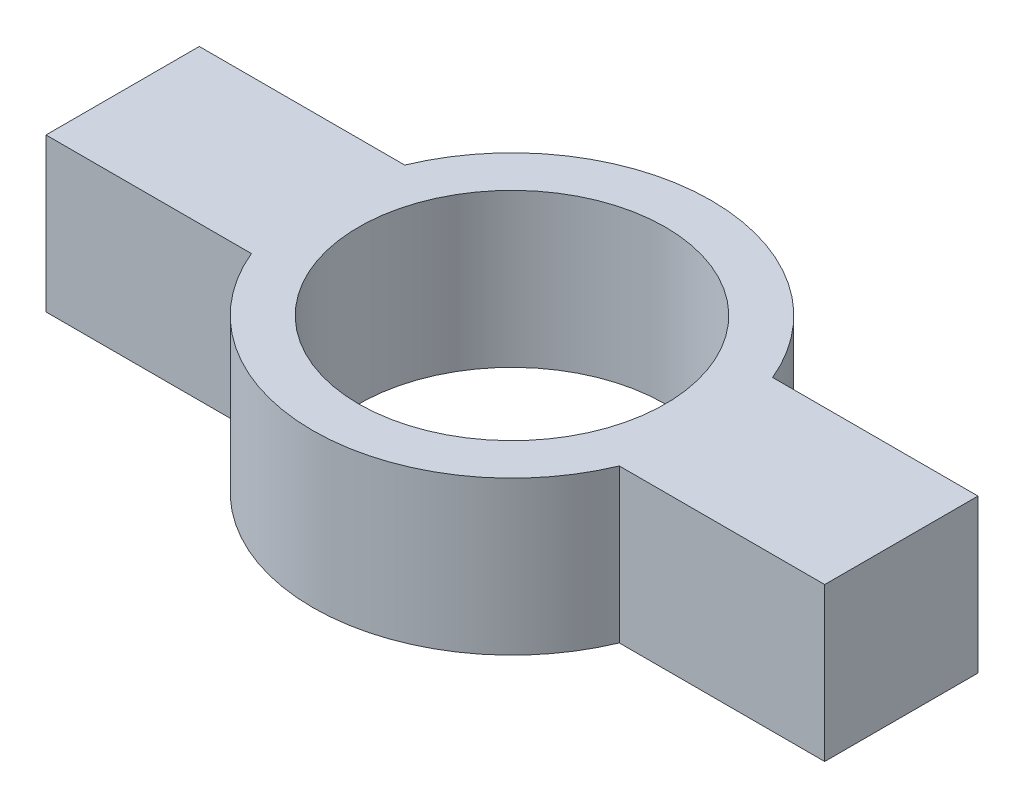
ISO-10303-21;
HEADER;
FILE_DESCRIPTION(('STEP AP214'),'2;1');
FILE_NAME('part.step','',(''),(''),'','','');
FILE_SCHEMA(('AUTOMOTIVE_DESIGN { 1 0 10303 214 1 1 1 1 }'));
ENDSEC;
DATA;
#1=APPLICATION_CONTEXT('core data for automotive mechanical design processes');
#2=APPLICATION_PROTOCOL_DEFINITION('international standard','automotive_design',2000,#1);
#3=PRODUCT_CONTEXT('',#1,'mechanical');
#4=PRODUCT('Part','Part','',(#3));
#5=PRODUCT_RELATED_PRODUCT_CATEGORY('part','',(#4));
#6=PRODUCT_DEFINITION_FORMATION('','',#4);
#7=PRODUCT_DEFINITION_CONTEXT('part definition',#1,'design');
#8=PRODUCT_DEFINITION('design','',#6,#7);
#9=PRODUCT_DEFINITION_SHAPE('','',#8);
#10=(LENGTH_UNIT() NAMED_UNIT(*) SI_UNIT(.MILLI.,.METRE.));
#11=(NAMED_UNIT(*) PLANE_ANGLE_UNIT() SI_UNIT($,.RADIAN.));
#12=(NAMED_UNIT(*) SI_UNIT($,.STERADIAN.) SOLID_ANGLE_UNIT());
#13=UNCERTAINTY_MEASURE_WITH_UNIT(LENGTH_MEASURE(1.E-05),#10,'distance_accuracy_value','');
#14=(GEOMETRIC_REPRESENTATION_CONTEXT(3) GLOBAL_UNCERTAINTY_ASSIGNED_CONTEXT((#13)) GLOBAL_UNIT_ASSIGNED_CONTEXT((#10,
#11,#12)) REPRESENTATION_CONTEXT('',''));
#15=CARTESIAN_POINT('',(0.,0.,0.));
#16=DIRECTION('',(0.,0.,1.));
#17=DIRECTION('',(1.,0.,0.));
#18=AXIS2_PLACEMENT_3D('',#15,#16,#17);
#19=CARTESIAN_POINT('',(0.,5.,0.));
#20=DIRECTION('',(0.,-1.,0.));
#21=DIRECTION('',(0.,0.,-1.));
#22=AXIS2_PLACEMENT_3D('',#19,#20,#21);
#23=CYLINDRICAL_SURFACE('',#22,6.5);
#24=DIRECTION('',(0.,-1.,0.));
#25=VECTOR('',#24,1.);
#26=CARTESIAN_POINT('',(-6.,5.,-2.5));
#27=LINE('',#26,#25);
#28=CARTESIAN_POINT('',(-6.,5.,-2.5));
#29=VERTEX_POINT('',#28);
#30=CARTESIAN_POINT('',(-6.,0.,-2.5));
#31=VERTEX_POINT('',#30);
#32=EDGE_CURVE('E135',#29,#31,#27,.T.);
#33=ORIENTED_EDGE('',*,*,#32,.F.);
#34=CARTESIAN_POINT('',(0.,5.,0.));
#35=DIRECTION('',(0.,1.,0.));
#36=DIRECTION('',(0.,0.,1.));
#37=AXIS2_PLACEMENT_3D('',#34,#35,#36);
#38=CIRCLE('',#37,6.5);
#39=CARTESIAN_POINT('',(6.,5.,-2.5));
#40=VERTEX_POINT('',#39);
#41=EDGE_CURVE('E11',#40,#29,#38,.T.);
#42=ORIENTED_EDGE('',*,*,#41,.F.);
#43=DIRECTION('',(0.,-1.,0.));
#44=VECTOR('',#43,1.);
#45=CARTESIAN_POINT('',(6.,5.,-2.5));
#46=LINE('',#45,#44);
#47=CARTESIAN_POINT('',(6.,0.,-2.5));
#48=VERTEX_POINT('',#47);
#49=EDGE_CURVE('E132',#48,#40,#46,.F.);
#50=ORIENTED_EDGE('',*,*,#49,.F.);
#51=CARTESIAN_POINT('',(0.,0.,0.));
#52=DIRECTION('',(0.,1.,0.));
#53=DIRECTION('',(0.,0.,1.));
#54=AXIS2_PLACEMENT_3D('',#51,#52,#53);
#55=CIRCLE('',#54,6.5);
#56=EDGE_CURVE('E58',#48,#31,#55,.T.);
#57=ORIENTED_EDGE('',*,*,#56,.T.);
#58=EDGE_LOOP('',(#33,#42,#50,#57));
#59=FACE_BOUND('',#58,.T.);
#60=ADVANCED_FACE('F35',(#59),#23,.T.);
#61=DIRECTION('',(0.,-1.,0.));
#62=VECTOR('',#61,1.);
#63=CARTESIAN_POINT('',(6.,5.,2.5));
#64=LINE('',#63,#62);
#65=CARTESIAN_POINT('',(6.,5.,2.5));
#66=VERTEX_POINT('',#65);
#67=CARTESIAN_POINT('',(6.,0.,2.5));
#68=VERTEX_POINT('',#67);
#69=EDGE_CURVE('E125',#66,#68,#64,.T.);
#70=ORIENTED_EDGE('',*,*,#69,.F.);
#71=CARTESIAN_POINT('',(-6.,5.,2.5));
#72=VERTEX_POINT('',#71);
#73=EDGE_CURVE('E43',#72,#66,#38,.T.);
#74=ORIENTED_EDGE('',*,*,#73,.F.);
#75=DIRECTION('',(0.,-1.,0.));
#76=VECTOR('',#75,1.);
#77=CARTESIAN_POINT('',(-6.,5.,2.5));
#78=LINE('',#77,#76);
#79=CARTESIAN_POINT('',(-6.,0.,2.5));
#80=VERTEX_POINT('',#79);
#81=EDGE_CURVE('E50',#80,#72,#78,.F.);
#82=ORIENTED_EDGE('',*,*,#81,.F.);
#83=EDGE_CURVE('E38',#80,#68,#55,.T.);
#84=ORIENTED_EDGE('',*,*,#83,.T.);
#85=EDGE_LOOP('',(#70,#74,#82,#84));
#86=FACE_BOUND('',#85,.T.);
#87=ADVANCED_FACE('F144',(#86),#23,.T.);
#88=CARTESIAN_POINT('',(0.,5.,0.));
#89=DIRECTION('',(0.,-1.,0.));
#90=DIRECTION('',(0.,0.,-1.));
#91=AXIS2_PLACEMENT_3D('',#88,#89,#90);
#92=CYLINDRICAL_SURFACE('',#91,5.);
#93=CARTESIAN_POINT('',(0.,5.,0.));
#94=DIRECTION('',(0.,1.,0.));
#95=DIRECTION('',(0.,0.,1.));
#96=AXIS2_PLACEMENT_3D('',#93,#94,#95);
#97=CIRCLE('',#96,5.);
#98=CARTESIAN_POINT('',(0.,5.,5.));
#99=VERTEX_POINT('',#98);
#100=EDGE_CURVE('E138',#99,#99,#97,.T.);
#101=ORIENTED_EDGE('',*,*,#100,.T.);
#102=EDGE_LOOP('',(#101));
#103=FACE_BOUND('',#102,.T.);
#104=CARTESIAN_POINT('',(0.,0.,0.));
#105=DIRECTION('',(0.,1.,0.));
#106=DIRECTION('',(0.,0.,1.));
#107=AXIS2_PLACEMENT_3D('',#104,#105,#106);
#108=CIRCLE('',#107,5.);
#109=CARTESIAN_POINT('',(0.,0.,5.));
#110=VERTEX_POINT('',#109);
#111=EDGE_CURVE('E137',#110,#110,#108,.T.);
#112=ORIENTED_EDGE('',*,*,#111,.F.);
#113=EDGE_LOOP('',(#112));
#114=FACE_BOUND('',#113,.T.);
#115=ADVANCED_FACE('F191',(#103,#114),#92,.F.);
#116=CARTESIAN_POINT('',(0.,5.,0.));
#117=DIRECTION('',(0.,1.,0.));
#118=DIRECTION('',(0.,0.,1.));
#119=AXIS2_PLACEMENT_3D('',#116,#117,#118);
#120=PLANE('',#119);
#121=ORIENTED_EDGE('',*,*,#100,.F.);
#122=EDGE_LOOP('',(#121));
#123=FACE_BOUND('',#122,.T.);
#124=DIRECTION('',(1.,0.,0.));
#125=VECTOR('',#124,1.);
#126=CARTESIAN_POINT('',(-12.7,5.,-2.5));
#127=LINE('',#126,#125);
#128=CARTESIAN_POINT('',(12.7,5.,-2.5));
#129=VERTEX_POINT('',#128);
#130=EDGE_CURVE('E123',#40,#129,#127,.T.);
#131=ORIENTED_EDGE('',*,*,#130,.F.);
#132=ORIENTED_EDGE('',*,*,#41,.T.);
#133=CARTESIAN_POINT('',(-12.7,5.,-2.5));
#134=VERTEX_POINT('',#133);
#135=EDGE_CURVE('E104',#134,#29,#127,.T.);
#136=ORIENTED_EDGE('',*,*,#135,.F.);
#137=DIRECTION('',(0.,0.,-1.));
#138=VECTOR('',#137,1.);
#139=CARTESIAN_POINT('',(-12.7,5.,2.5));
#140=LINE('',#139,#138);
#141=CARTESIAN_POINT('',(-12.7,5.,2.5));
#142=VERTEX_POINT('',#141);
#143=EDGE_CURVE('E110',#142,#134,#140,.T.);
#144=ORIENTED_EDGE('',*,*,#143,.F.);
#145=DIRECTION('',(1.,0.,0.));
#146=VECTOR('',#145,1.);
#147=CARTESIAN_POINT('',(-12.7,5.,2.5));
#148=LINE('',#147,#146);
#149=EDGE_CURVE('E160',#142,#72,#148,.T.);
#150=ORIENTED_EDGE('',*,*,#149,.T.);
#151=ORIENTED_EDGE('',*,*,#73,.T.);
#152=CARTESIAN_POINT('',(12.7,5.,2.5));
#153=VERTEX_POINT('',#152);
#154=EDGE_CURVE('E154',#66,#153,#148,.T.);
#155=ORIENTED_EDGE('',*,*,#154,.T.);
#156=DIRECTION('',(0.,0.,-1.));
#157=VECTOR('',#156,1.);
#158=CARTESIAN_POINT('',(12.7,5.,2.5));
#159=LINE('',#158,#157);
#160=EDGE_CURVE('E169',#153,#129,#159,.T.);
#161=ORIENTED_EDGE('',*,*,#160,.T.);
#162=EDGE_LOOP('',(#131,#132,#136,#144,#150,#151,#155,#161));
#163=FACE_BOUND('',#162,.T.);
#164=ADVANCED_FACE('F122',(#123,#163),#120,.T.);
#165=CARTESIAN_POINT('',(0.,0.,0.));
#166=DIRECTION('',(0.,1.,0.));
#167=DIRECTION('',(0.,0.,1.));
#168=AXIS2_PLACEMENT_3D('',#165,#166,#167);
#169=PLANE('',#168);
#170=ORIENTED_EDGE('',*,*,#111,.T.);
#171=EDGE_LOOP('',(#170));
#172=FACE_BOUND('',#171,.T.);
#173=DIRECTION('',(1.,0.,0.));
#174=VECTOR('',#173,1.);
#175=CARTESIAN_POINT('',(-12.7,0.,2.5));
#176=LINE('',#175,#174);
#177=CARTESIAN_POINT('',(12.7,0.,2.5));
#178=VERTEX_POINT('',#177);
#179=EDGE_CURVE('E152',#68,#178,#176,.T.);
#180=ORIENTED_EDGE('',*,*,#179,.F.);
#181=ORIENTED_EDGE('',*,*,#83,.F.);
#182=CARTESIAN_POINT('',(-12.7,0.,2.5));
#183=VERTEX_POINT('',#182);
#184=EDGE_CURVE('E159',#183,#80,#176,.T.);
#185=ORIENTED_EDGE('',*,*,#184,.F.);
#186=DIRECTION('',(0.,0.,1.));
#187=VECTOR('',#186,1.);
#188=CARTESIAN_POINT('',(-12.7,0.,2.5));
#189=LINE('',#188,#187);
#190=CARTESIAN_POINT('',(-12.7,0.,-2.5));
#191=VERTEX_POINT('',#190);
#192=EDGE_CURVE('E109',#191,#183,#189,.T.);
#193=ORIENTED_EDGE('',*,*,#192,.F.);
#194=DIRECTION('',(1.,0.,0.));
#195=VECTOR('',#194,1.);
#196=CARTESIAN_POINT('',(-12.7,0.,-2.5));
#197=LINE('',#196,#195);
#198=EDGE_CURVE('E106',#191,#31,#197,.T.);
#199=ORIENTED_EDGE('',*,*,#198,.T.);
#200=ORIENTED_EDGE('',*,*,#56,.F.);
#201=CARTESIAN_POINT('',(12.7,0.,-2.5));
#202=VERTEX_POINT('',#201);
#203=EDGE_CURVE('E161',#48,#202,#197,.T.);
#204=ORIENTED_EDGE('',*,*,#203,.T.);
#205=DIRECTION('',(0.,0.,1.));
#206=VECTOR('',#205,1.);
#207=CARTESIAN_POINT('',(12.7,0.,2.5));
#208=LINE('',#207,#206);
#209=EDGE_CURVE('E157',#202,#178,#208,.T.);
#210=ORIENTED_EDGE('',*,*,#209,.T.);
#211=EDGE_LOOP('',(#180,#181,#185,#193,#199,#200,#204,#210));
#212=FACE_BOUND('',#211,.T.);
#213=ADVANCED_FACE('F155',(#172,#212),#169,.F.);
#214=CARTESIAN_POINT('',(-12.7,0.,0.));
#215=DIRECTION('',(-1.,0.,0.));
#216=DIRECTION('',(0.,0.,1.));
#217=AXIS2_PLACEMENT_3D('',#214,#215,#216);
#218=PLANE('',#217);
#219=ORIENTED_EDGE('',*,*,#143,.T.);
#220=DIRECTION('',(0.,-1.,0.));
#221=VECTOR('',#220,1.);
#222=CARTESIAN_POINT('',(-12.7,5.,-2.5));
#223=LINE('',#222,#221);
#224=EDGE_CURVE('E100',#134,#191,#223,.T.);
#225=ORIENTED_EDGE('',*,*,#224,.T.);
#226=ORIENTED_EDGE('',*,*,#192,.T.);
#227=DIRECTION('',(0.,1.,0.));
#228=VECTOR('',#227,1.);
#229=CARTESIAN_POINT('',(-12.7,5.,2.5));
#230=LINE('',#229,#228);
#231=EDGE_CURVE('E115',#183,#142,#230,.T.);
#232=ORIENTED_EDGE('',*,*,#231,.T.);
#233=EDGE_LOOP('',(#219,#225,#226,#232));
#234=FACE_BOUND('',#233,.T.);
#235=ADVANCED_FACE('F113',(#234),#218,.T.);
#236=CARTESIAN_POINT('',(-12.7,5.,2.5));
#237=DIRECTION('',(0.,0.,-1.));
#238=DIRECTION('',(0.,1.,0.));
#239=AXIS2_PLACEMENT_3D('',#236,#237,#238);
#240=PLANE('',#239);
#241=ORIENTED_EDGE('',*,*,#184,.T.);
#242=ORIENTED_EDGE('',*,*,#81,.T.);
#243=ORIENTED_EDGE('',*,*,#149,.F.);
#244=ORIENTED_EDGE('',*,*,#231,.F.);
#245=EDGE_LOOP('',(#241,#242,#243,#244));
#246=FACE_BOUND('',#245,.T.);
#247=ADVANCED_FACE('F174',(#246),#240,.F.);
#248=CARTESIAN_POINT('',(-12.7,5.,-2.5));
#249=DIRECTION('',(0.,0.,1.));
#250=DIRECTION('',(1.,0.,0.));
#251=AXIS2_PLACEMENT_3D('',#248,#249,#250);
#252=PLANE('',#251);
#253=ORIENTED_EDGE('',*,*,#135,.T.);
#254=ORIENTED_EDGE('',*,*,#32,.T.);
#255=ORIENTED_EDGE('',*,*,#198,.F.);
#256=ORIENTED_EDGE('',*,*,#224,.F.);
#257=EDGE_LOOP('',(#253,#254,#255,#256));
#258=FACE_BOUND('',#257,.T.);
#259=ADVANCED_FACE('F102',(#258),#252,.F.);
#260=ORIENTED_EDGE('',*,*,#203,.F.);
#261=ORIENTED_EDGE('',*,*,#49,.T.);
#262=ORIENTED_EDGE('',*,*,#130,.T.);
#263=DIRECTION('',(0.,-1.,0.));
#264=VECTOR('',#263,1.);
#265=CARTESIAN_POINT('',(12.7,5.,-2.5));
#266=LINE('',#265,#264);
#267=EDGE_CURVE('E166',#129,#202,#266,.T.);
#268=ORIENTED_EDGE('',*,*,#267,.T.);
#269=EDGE_LOOP('',(#260,#261,#262,#268));
#270=FACE_BOUND('',#269,.T.);
#271=ADVANCED_FACE('F181',(#270),#252,.F.);
#272=ORIENTED_EDGE('',*,*,#154,.F.);
#273=ORIENTED_EDGE('',*,*,#69,.T.);
#274=ORIENTED_EDGE('',*,*,#179,.T.);
#275=DIRECTION('',(0.,1.,0.));
#276=VECTOR('',#275,1.);
#277=CARTESIAN_POINT('',(12.7,5.,2.5));
#278=LINE('',#277,#276);
#279=EDGE_CURVE('E119',#178,#153,#278,.T.);
#280=ORIENTED_EDGE('',*,*,#279,.T.);
#281=EDGE_LOOP('',(#272,#273,#274,#280));
#282=FACE_BOUND('',#281,.T.);
#283=ADVANCED_FACE('F150',(#282),#240,.F.);
#284=CARTESIAN_POINT('',(12.7,0.,0.));
#285=DIRECTION('',(-1.,0.,0.));
#286=DIRECTION('',(0.,0.,1.));
#287=AXIS2_PLACEMENT_3D('',#284,#285,#286);
#288=PLANE('',#287);
#289=ORIENTED_EDGE('',*,*,#160,.F.);
#290=ORIENTED_EDGE('',*,*,#279,.F.);
#291=ORIENTED_EDGE('',*,*,#209,.F.);
#292=ORIENTED_EDGE('',*,*,#267,.F.);
#293=EDGE_LOOP('',(#289,#290,#291,#292));
#294=FACE_BOUND('',#293,.T.);
#295=ADVANCED_FACE('F186',(#294),#288,.F.);
#296=CLOSED_SHELL('',(#60,#87,#115,#164,#213,#235,#247,#259,#271,#283,#295));
#297=MANIFOLD_SOLID_BREP('B2',#296);
#298=ADVANCED_BREP_SHAPE_REPRESENTATION('',(#18,#297),#14);
#299=SHAPE_DEFINITION_REPRESENTATION(#9,#298);
ENDSEC;
END-ISO-10303-21;
